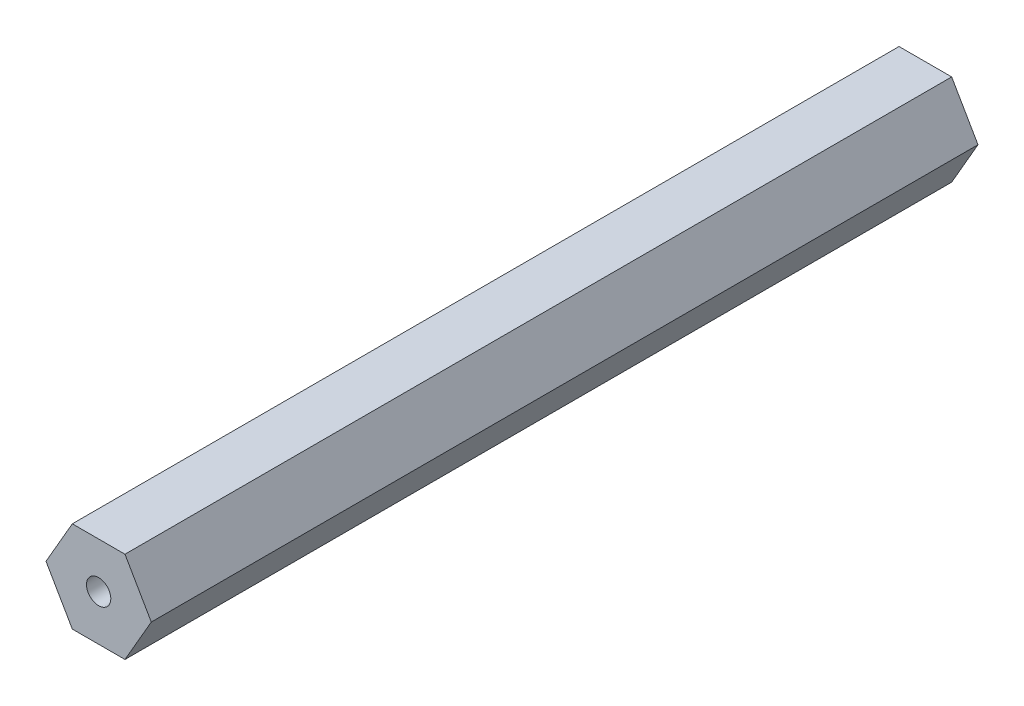
ISO-10303-21;
HEADER;
FILE_DESCRIPTION(('STEP AP214'),'2;1');
FILE_NAME('part.step','',(''),(''),'','','');
FILE_SCHEMA(('AUTOMOTIVE_DESIGN { 1 0 10303 214 1 1 1 1 }'));
ENDSEC;
DATA;
#1=APPLICATION_CONTEXT('core data for automotive mechanical design processes');
#2=APPLICATION_PROTOCOL_DEFINITION('international standard','automotive_design',2000,#1);
#3=PRODUCT_CONTEXT('',#1,'mechanical');
#4=PRODUCT('Part','Part','',(#3));
#5=PRODUCT_RELATED_PRODUCT_CATEGORY('part','',(#4));
#6=PRODUCT_DEFINITION_FORMATION('','',#4);
#7=PRODUCT_DEFINITION_CONTEXT('part definition',#1,'design');
#8=PRODUCT_DEFINITION('design','',#6,#7);
#9=PRODUCT_DEFINITION_SHAPE('','',#8);
#10=(LENGTH_UNIT() NAMED_UNIT(*) SI_UNIT(.MILLI.,.METRE.));
#11=(NAMED_UNIT(*) PLANE_ANGLE_UNIT() SI_UNIT($,.RADIAN.));
#12=(NAMED_UNIT(*) SI_UNIT($,.STERADIAN.) SOLID_ANGLE_UNIT());
#13=UNCERTAINTY_MEASURE_WITH_UNIT(LENGTH_MEASURE(1.E-05),#10,'distance_accuracy_value','');
#14=(GEOMETRIC_REPRESENTATION_CONTEXT(3) GLOBAL_UNCERTAINTY_ASSIGNED_CONTEXT((#13)) GLOBAL_UNIT_ASSIGNED_CONTEXT((#10,
#11,#12)) REPRESENTATION_CONTEXT('',''));
#15=CARTESIAN_POINT('',(0.,0.,0.));
#16=DIRECTION('',(0.,0.,1.));
#17=DIRECTION('',(1.,0.,0.));
#18=AXIS2_PLACEMENT_3D('',#15,#16,#17);
#19=CARTESIAN_POINT('',(0.,0.,86.36));
#20=DIRECTION('',(0.,0.,1.));
#21=DIRECTION('',(1.,0.,0.));
#22=AXIS2_PLACEMENT_3D('',#19,#20,#21);
#23=PLANE('',#22);
#24=DIRECTION('',(0.5,0.866025403784439,0.));
#25=VECTOR('',#24,1.);
#26=CARTESIAN_POINT('',(13.6584086693048,-7.43009006412703,86.36));
#27=LINE('',#26,#25);
#28=CARTESIAN_POINT('',(13.6584086693048,-7.43009006412703,86.36));
#29=VERTEX_POINT('',#28);
#30=CARTESIAN_POINT('',(16.4080393263204,-2.66759006412703,86.36));
#31=VERTEX_POINT('',#30);
#32=EDGE_CURVE('E133',#29,#31,#27,.T.);
#33=ORIENTED_EDGE('',*,*,#32,.T.);
#34=DIRECTION('',(-0.5,0.866025403784439,0.));
#35=VECTOR('',#34,1.);
#36=CARTESIAN_POINT('',(16.4080393263204,-2.66759006412703,86.36));
#37=LINE('',#36,#35);
#38=CARTESIAN_POINT('',(13.6584086693048,2.09490993587297,86.36));
#39=VERTEX_POINT('',#38);
#40=EDGE_CURVE('E91',#31,#39,#37,.T.);
#41=ORIENTED_EDGE('',*,*,#40,.T.);
#42=DIRECTION('',(-1.,0.,0.));
#43=VECTOR('',#42,1.);
#44=CARTESIAN_POINT('',(13.6584086693048,2.09490993587297,86.36));
#45=LINE('',#44,#43);
#46=CARTESIAN_POINT('',(8.1591473552736,2.09490993587297,86.36));
#47=VERTEX_POINT('',#46);
#48=EDGE_CURVE('E104',#39,#47,#45,.T.);
#49=ORIENTED_EDGE('',*,*,#48,.T.);
#50=DIRECTION('',(-0.5,-0.866025403784439,0.));
#51=VECTOR('',#50,1.);
#52=CARTESIAN_POINT('',(8.1591473552736,2.09490993587297,86.36));
#53=LINE('',#52,#51);
#54=CARTESIAN_POINT('',(5.40951669825801,-2.66759006412703,86.36));
#55=VERTEX_POINT('',#54);
#56=EDGE_CURVE('E98',#47,#55,#53,.T.);
#57=ORIENTED_EDGE('',*,*,#56,.T.);
#58=DIRECTION('',(0.5,-0.866025403784438,0.));
#59=VECTOR('',#58,1.);
#60=CARTESIAN_POINT('',(5.40951669825801,-2.66759006412703,86.36));
#61=LINE('',#60,#59);
#62=CARTESIAN_POINT('',(8.1591473552736,-7.43009006412703,86.36));
#63=VERTEX_POINT('',#62);
#64=EDGE_CURVE('E102',#55,#63,#61,.T.);
#65=ORIENTED_EDGE('',*,*,#64,.T.);
#66=DIRECTION('',(1.,0.,0.));
#67=VECTOR('',#66,1.);
#68=CARTESIAN_POINT('',(8.1591473552736,-7.43009006412703,86.36));
#69=LINE('',#68,#67);
#70=EDGE_CURVE('E54',#63,#29,#69,.T.);
#71=ORIENTED_EDGE('',*,*,#70,.T.);
#72=EDGE_LOOP('',(#33,#41,#49,#57,#65,#71));
#73=FACE_BOUND('',#72,.T.);
#74=CARTESIAN_POINT('',(10.9087780122892,-2.66759006412703,86.36));
#75=DIRECTION('',(0.,0.,1.));
#76=DIRECTION('',(1.,0.,0.));
#77=AXIS2_PLACEMENT_3D('',#74,#75,#76);
#78=CIRCLE('',#77,1.27);
#79=CARTESIAN_POINT('',(12.1787780122892,-2.66759006412703,86.36));
#80=VERTEX_POINT('',#79);
#81=EDGE_CURVE('E126',#80,#80,#78,.T.);
#82=ORIENTED_EDGE('',*,*,#81,.F.);
#83=EDGE_LOOP('',(#82));
#84=FACE_BOUND('',#83,.T.);
#85=ADVANCED_FACE('F37',(#73,#84),#23,.T.);
#86=CARTESIAN_POINT('',(0.,0.,0.));
#87=DIRECTION('',(0.,0.,1.));
#88=DIRECTION('',(1.,0.,0.));
#89=AXIS2_PLACEMENT_3D('',#86,#87,#88);
#90=PLANE('',#89);
#91=DIRECTION('',(0.5,0.866025403784439,0.));
#92=VECTOR('',#91,1.);
#93=CARTESIAN_POINT('',(13.6584086693048,-7.43009006412703,0.));
#94=LINE('',#93,#92);
#95=CARTESIAN_POINT('',(13.6584086693048,-7.43009006412703,0.));
#96=VERTEX_POINT('',#95);
#97=CARTESIAN_POINT('',(16.4080393263204,-2.66759006412703,0.));
#98=VERTEX_POINT('',#97);
#99=EDGE_CURVE('E122',#96,#98,#94,.T.);
#100=ORIENTED_EDGE('',*,*,#99,.F.);
#101=DIRECTION('',(1.,0.,0.));
#102=VECTOR('',#101,1.);
#103=CARTESIAN_POINT('',(8.1591473552736,-7.43009006412703,0.));
#104=LINE('',#103,#102);
#105=CARTESIAN_POINT('',(8.1591473552736,-7.43009006412703,0.));
#106=VERTEX_POINT('',#105);
#107=EDGE_CURVE('E83',#106,#96,#104,.T.);
#108=ORIENTED_EDGE('',*,*,#107,.F.);
#109=DIRECTION('',(0.5,-0.866025403784438,0.));
#110=VECTOR('',#109,1.);
#111=CARTESIAN_POINT('',(5.40951669825801,-2.66759006412703,0.));
#112=LINE('',#111,#110);
#113=CARTESIAN_POINT('',(5.40951669825801,-2.66759006412703,0.));
#114=VERTEX_POINT('',#113);
#115=EDGE_CURVE('E77',#114,#106,#112,.T.);
#116=ORIENTED_EDGE('',*,*,#115,.F.);
#117=DIRECTION('',(-0.5,-0.866025403784439,0.));
#118=VECTOR('',#117,1.);
#119=CARTESIAN_POINT('',(8.1591473552736,2.09490993587297,0.));
#120=LINE('',#119,#118);
#121=CARTESIAN_POINT('',(8.1591473552736,2.09490993587297,0.));
#122=VERTEX_POINT('',#121);
#123=EDGE_CURVE('E112',#122,#114,#120,.T.);
#124=ORIENTED_EDGE('',*,*,#123,.F.);
#125=DIRECTION('',(-1.,0.,0.));
#126=VECTOR('',#125,1.);
#127=CARTESIAN_POINT('',(13.6584086693048,2.09490993587297,0.));
#128=LINE('',#127,#126);
#129=CARTESIAN_POINT('',(13.6584086693048,2.09490993587297,0.));
#130=VERTEX_POINT('',#129);
#131=EDGE_CURVE('E128',#130,#122,#128,.T.);
#132=ORIENTED_EDGE('',*,*,#131,.F.);
#133=DIRECTION('',(-0.5,0.866025403784439,0.));
#134=VECTOR('',#133,1.);
#135=CARTESIAN_POINT('',(16.4080393263204,-2.66759006412703,0.));
#136=LINE('',#135,#134);
#137=EDGE_CURVE('E125',#98,#130,#136,.T.);
#138=ORIENTED_EDGE('',*,*,#137,.F.);
#139=EDGE_LOOP('',(#100,#108,#116,#124,#132,#138));
#140=FACE_BOUND('',#139,.T.);
#141=CARTESIAN_POINT('',(10.9087780122892,-2.66759006412703,0.));
#142=DIRECTION('',(0.,0.,1.));
#143=DIRECTION('',(1.,0.,0.));
#144=AXIS2_PLACEMENT_3D('',#141,#142,#143);
#145=CIRCLE('',#144,1.27);
#146=CARTESIAN_POINT('',(12.1787780122892,-2.66759006412703,0.));
#147=VERTEX_POINT('',#146);
#148=EDGE_CURVE('E244',#147,#147,#145,.T.);
#149=ORIENTED_EDGE('',*,*,#148,.T.);
#150=EDGE_LOOP('',(#149));
#151=FACE_BOUND('',#150,.T.);
#152=ADVANCED_FACE('F142',(#140,#151),#90,.F.);
#153=CARTESIAN_POINT('',(13.6584086693048,-7.43009006412703,86.36));
#154=DIRECTION('',(-0.866025403784439,0.5,0.));
#155=DIRECTION('',(-0.5,-0.866025403784439,0.));
#156=AXIS2_PLACEMENT_3D('',#153,#154,#155);
#157=PLANE('',#156);
#158=ORIENTED_EDGE('',*,*,#99,.T.);
#159=DIRECTION('',(0.,0.,-1.));
#160=VECTOR('',#159,1.);
#161=CARTESIAN_POINT('',(16.4080393263204,-2.66759006412703,86.36));
#162=LINE('',#161,#160);
#163=EDGE_CURVE('E11',#31,#98,#162,.T.);
#164=ORIENTED_EDGE('',*,*,#163,.F.);
#165=ORIENTED_EDGE('',*,*,#32,.F.);
#166=DIRECTION('',(0.,0.,-1.));
#167=VECTOR('',#166,1.);
#168=CARTESIAN_POINT('',(13.6584086693048,-7.43009006412703,86.36));
#169=LINE('',#168,#167);
#170=EDGE_CURVE('E118',#29,#96,#169,.T.);
#171=ORIENTED_EDGE('',*,*,#170,.T.);
#172=EDGE_LOOP('',(#158,#164,#165,#171));
#173=FACE_BOUND('',#172,.T.);
#174=ADVANCED_FACE('F39',(#173),#157,.F.);
#175=CARTESIAN_POINT('',(16.4080393263204,-2.66759006412703,86.36));
#176=DIRECTION('',(-0.866025403784439,-0.5,0.));
#177=DIRECTION('',(0.5,-0.866025403784439,0.));
#178=AXIS2_PLACEMENT_3D('',#175,#176,#177);
#179=PLANE('',#178);
#180=ORIENTED_EDGE('',*,*,#137,.T.);
#181=DIRECTION('',(0.,0.,-1.));
#182=VECTOR('',#181,1.);
#183=CARTESIAN_POINT('',(13.6584086693048,2.09490993587297,86.36));
#184=LINE('',#183,#182);
#185=EDGE_CURVE('E46',#39,#130,#184,.T.);
#186=ORIENTED_EDGE('',*,*,#185,.F.);
#187=ORIENTED_EDGE('',*,*,#40,.F.);
#188=ORIENTED_EDGE('',*,*,#163,.T.);
#189=EDGE_LOOP('',(#180,#186,#187,#188));
#190=FACE_BOUND('',#189,.T.);
#191=ADVANCED_FACE('F167',(#190),#179,.F.);
#192=CARTESIAN_POINT('',(13.6584086693048,2.09490993587297,86.36));
#193=DIRECTION('',(0.,-1.,0.));
#194=DIRECTION('',(0.,0.,-1.));
#195=AXIS2_PLACEMENT_3D('',#192,#193,#194);
#196=PLANE('',#195);
#197=ORIENTED_EDGE('',*,*,#131,.T.);
#198=DIRECTION('',(0.,0.,-1.));
#199=VECTOR('',#198,1.);
#200=CARTESIAN_POINT('',(8.1591473552736,2.09490993587297,86.36));
#201=LINE('',#200,#199);
#202=EDGE_CURVE('E113',#47,#122,#201,.T.);
#203=ORIENTED_EDGE('',*,*,#202,.F.);
#204=ORIENTED_EDGE('',*,*,#48,.F.);
#205=ORIENTED_EDGE('',*,*,#185,.T.);
#206=EDGE_LOOP('',(#197,#203,#204,#205));
#207=FACE_BOUND('',#206,.T.);
#208=ADVANCED_FACE('F139',(#207),#196,.F.);
#209=CARTESIAN_POINT('',(8.1591473552736,2.09490993587297,86.36));
#210=DIRECTION('',(0.866025403784439,-0.5,0.));
#211=DIRECTION('',(0.5,0.866025403784439,0.));
#212=AXIS2_PLACEMENT_3D('',#209,#210,#211);
#213=PLANE('',#212);
#214=ORIENTED_EDGE('',*,*,#123,.T.);
#215=DIRECTION('',(0.,0.,-1.));
#216=VECTOR('',#215,1.);
#217=CARTESIAN_POINT('',(5.40951669825801,-2.66759006412703,86.36));
#218=LINE('',#217,#216);
#219=EDGE_CURVE('E109',#55,#114,#218,.T.);
#220=ORIENTED_EDGE('',*,*,#219,.F.);
#221=ORIENTED_EDGE('',*,*,#56,.F.);
#222=ORIENTED_EDGE('',*,*,#202,.T.);
#223=EDGE_LOOP('',(#214,#220,#221,#222));
#224=FACE_BOUND('',#223,.T.);
#225=ADVANCED_FACE('F110',(#224),#213,.F.);
#226=CARTESIAN_POINT('',(5.40951669825801,-2.66759006412703,86.36));
#227=DIRECTION('',(0.866025403784438,0.5,0.));
#228=DIRECTION('',(-0.5,0.866025403784438,0.));
#229=AXIS2_PLACEMENT_3D('',#226,#227,#228);
#230=PLANE('',#229);
#231=ORIENTED_EDGE('',*,*,#115,.T.);
#232=DIRECTION('',(0.,0.,-1.));
#233=VECTOR('',#232,1.);
#234=CARTESIAN_POINT('',(8.1591473552736,-7.43009006412703,86.36));
#235=LINE('',#234,#233);
#236=EDGE_CURVE('E114',#63,#106,#235,.T.);
#237=ORIENTED_EDGE('',*,*,#236,.F.);
#238=ORIENTED_EDGE('',*,*,#64,.F.);
#239=ORIENTED_EDGE('',*,*,#219,.T.);
#240=EDGE_LOOP('',(#231,#237,#238,#239));
#241=FACE_BOUND('',#240,.T.);
#242=ADVANCED_FACE('F116',(#241),#230,.F.);
#243=CARTESIAN_POINT('',(8.1591473552736,-7.43009006412703,86.36));
#244=DIRECTION('',(0.,1.,0.));
#245=DIRECTION('',(-1.,0.,0.));
#246=AXIS2_PLACEMENT_3D('',#243,#244,#245);
#247=PLANE('',#246);
#248=ORIENTED_EDGE('',*,*,#107,.T.);
#249=ORIENTED_EDGE('',*,*,#170,.F.);
#250=ORIENTED_EDGE('',*,*,#70,.F.);
#251=ORIENTED_EDGE('',*,*,#236,.T.);
#252=EDGE_LOOP('',(#248,#249,#250,#251));
#253=FACE_BOUND('',#252,.T.);
#254=ADVANCED_FACE('F147',(#253),#247,.F.);
#255=CARTESIAN_POINT('',(10.9087780122892,-2.66759006412703,86.36));
#256=DIRECTION('',(0.,0.,-1.));
#257=DIRECTION('',(-1.,0.,0.));
#258=AXIS2_PLACEMENT_3D('',#255,#256,#257);
#259=CYLINDRICAL_SURFACE('',#258,1.27);
#260=ORIENTED_EDGE('',*,*,#81,.T.);
#261=EDGE_LOOP('',(#260));
#262=FACE_BOUND('',#261,.T.);
#263=ORIENTED_EDGE('',*,*,#148,.F.);
#264=EDGE_LOOP('',(#263));
#265=FACE_BOUND('',#264,.T.);
#266=ADVANCED_FACE('F149',(#262,#265),#259,.F.);
#267=CLOSED_SHELL('',(#85,#152,#174,#191,#208,#225,#242,#254,#266));
#268=MANIFOLD_SOLID_BREP('B2',#267);
#269=ADVANCED_BREP_SHAPE_REPRESENTATION('',(#18,#268),#14);
#270=SHAPE_DEFINITION_REPRESENTATION(#9,#269);
ENDSEC;
END-ISO-10303-21;
